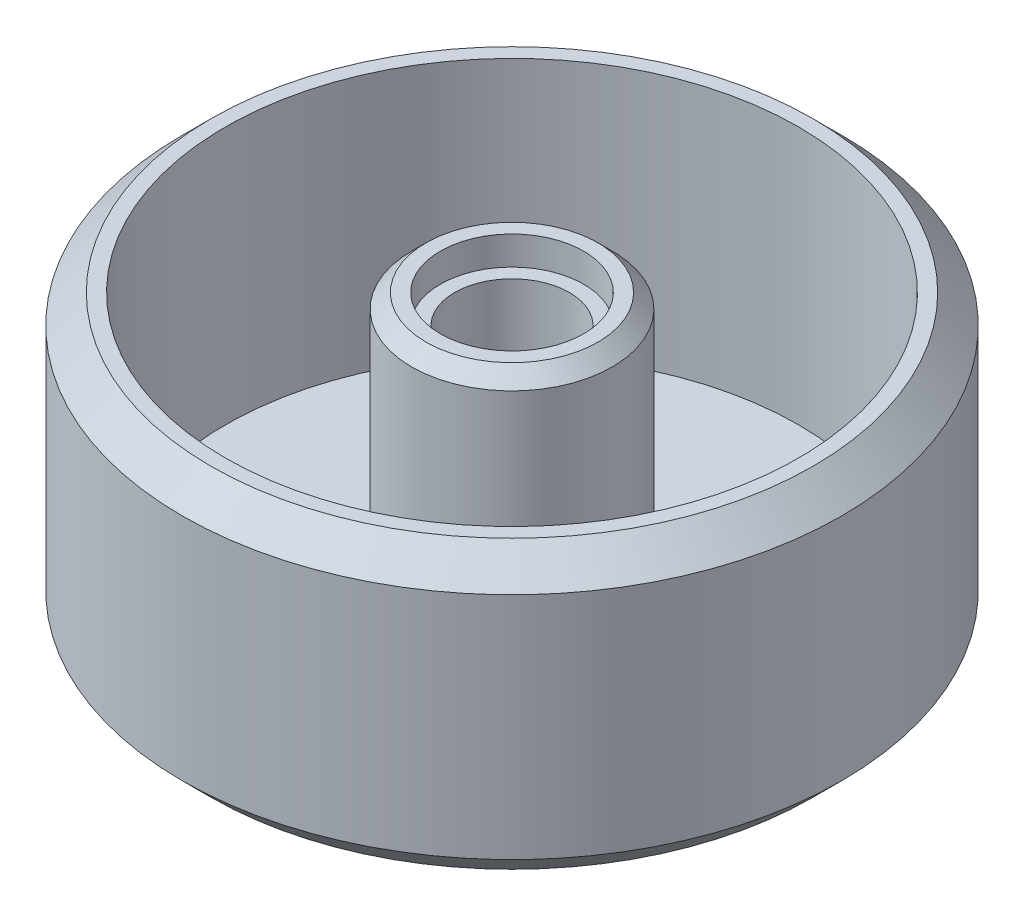
ISO-10303-21;
HEADER;
FILE_DESCRIPTION(('STEP AP214'),'2;1');
FILE_NAME('part.step','',(''),(''),'','','');
FILE_SCHEMA(('AUTOMOTIVE_DESIGN { 1 0 10303 214 1 1 1 1 }'));
ENDSEC;
DATA;
#1=APPLICATION_CONTEXT('core data for automotive mechanical design processes');
#2=APPLICATION_PROTOCOL_DEFINITION('international standard','automotive_design',2000,#1);
#3=PRODUCT_CONTEXT('',#1,'mechanical');
#4=PRODUCT('Part','Part','',(#3));
#5=PRODUCT_RELATED_PRODUCT_CATEGORY('part','',(#4));
#6=PRODUCT_DEFINITION_FORMATION('','',#4);
#7=PRODUCT_DEFINITION_CONTEXT('part definition',#1,'design');
#8=PRODUCT_DEFINITION('design','',#6,#7);
#9=PRODUCT_DEFINITION_SHAPE('','',#8);
#10=(LENGTH_UNIT() NAMED_UNIT(*) SI_UNIT(.MILLI.,.METRE.));
#11=(NAMED_UNIT(*) PLANE_ANGLE_UNIT() SI_UNIT($,.RADIAN.));
#12=(NAMED_UNIT(*) SI_UNIT($,.STERADIAN.) SOLID_ANGLE_UNIT());
#13=UNCERTAINTY_MEASURE_WITH_UNIT(LENGTH_MEASURE(1.E-05),#10,'distance_accuracy_value','');
#14=(GEOMETRIC_REPRESENTATION_CONTEXT(3) GLOBAL_UNCERTAINTY_ASSIGNED_CONTEXT((#13)) GLOBAL_UNIT_ASSIGNED_CONTEXT((#10,
#11,#12)) REPRESENTATION_CONTEXT('',''));
#15=CARTESIAN_POINT('',(0.,0.,0.));
#16=DIRECTION('',(0.,0.,1.));
#17=DIRECTION('',(1.,0.,0.));
#18=AXIS2_PLACEMENT_3D('',#15,#16,#17);
#19=CARTESIAN_POINT('',(0.,10.,0.));
#20=DIRECTION('',(0.,-1.,0.));
#21=DIRECTION('',(0.,0.,-1.));
#22=AXIS2_PLACEMENT_3D('',#19,#20,#21);
#23=CYLINDRICAL_SURFACE('',#22,11.5);
#24=CARTESIAN_POINT('',(0.,1.,0.));
#25=DIRECTION('',(0.,1.,0.));
#26=DIRECTION('',(0.,0.,1.));
#27=AXIS2_PLACEMENT_3D('',#24,#25,#26);
#28=CIRCLE('',#27,11.5);
#29=CARTESIAN_POINT('',(0.,1.,11.5));
#30=VERTEX_POINT('',#29);
#31=EDGE_CURVE('E52',#30,#30,#28,.T.);
#32=ORIENTED_EDGE('',*,*,#31,.T.);
#33=EDGE_LOOP('',(#32));
#34=FACE_BOUND('',#33,.T.);
#35=CARTESIAN_POINT('',(0.,9.,0.));
#36=DIRECTION('',(0.,1.,0.));
#37=DIRECTION('',(0.,0.,1.));
#38=AXIS2_PLACEMENT_3D('',#35,#36,#37);
#39=CIRCLE('',#38,11.5);
#40=CARTESIAN_POINT('',(0.,9.,11.5));
#41=VERTEX_POINT('',#40);
#42=EDGE_CURVE('E55',#41,#41,#39,.F.);
#43=ORIENTED_EDGE('',*,*,#42,.T.);
#44=EDGE_LOOP('',(#43));
#45=FACE_BOUND('',#44,.T.);
#46=ADVANCED_FACE('F32',(#34,#45),#23,.T.);
#47=CARTESIAN_POINT('',(0.,10.,0.));
#48=DIRECTION('',(0.,1.,0.));
#49=DIRECTION('',(0.,0.,1.));
#50=AXIS2_PLACEMENT_3D('',#47,#48,#49);
#51=PLANE('',#50);
#52=CARTESIAN_POINT('',(0.,10.,0.));
#53=DIRECTION('',(0.,1.,0.));
#54=DIRECTION('',(0.,0.,1.));
#55=AXIS2_PLACEMENT_3D('',#52,#53,#54);
#56=CIRCLE('',#55,10.5);
#57=CARTESIAN_POINT('',(0.,10.,10.5));
#58=VERTEX_POINT('',#57);
#59=EDGE_CURVE('E43',#58,#58,#56,.T.);
#60=ORIENTED_EDGE('',*,*,#59,.T.);
#61=EDGE_LOOP('',(#60));
#62=FACE_BOUND('',#61,.T.);
#63=CARTESIAN_POINT('',(0.,10.,0.));
#64=DIRECTION('',(0.,1.,0.));
#65=DIRECTION('',(0.,0.,1.));
#66=AXIS2_PLACEMENT_3D('',#63,#64,#65);
#67=CIRCLE('',#66,10.);
#68=CARTESIAN_POINT('',(0.,10.,10.));
#69=VERTEX_POINT('',#68);
#70=EDGE_CURVE('E59',#69,#69,#67,.T.);
#71=ORIENTED_EDGE('',*,*,#70,.F.);
#72=EDGE_LOOP('',(#71));
#73=FACE_BOUND('',#72,.T.);
#74=ADVANCED_FACE('F104',(#62,#73),#51,.T.);
#75=CARTESIAN_POINT('',(0.,0.,0.));
#76=DIRECTION('',(0.,1.,0.));
#77=DIRECTION('',(0.,0.,1.));
#78=AXIS2_PLACEMENT_3D('',#75,#76,#77);
#79=PLANE('',#78);
#80=CARTESIAN_POINT('',(0.,0.,0.));
#81=DIRECTION('',(0.,1.,0.));
#82=DIRECTION('',(0.,0.,1.));
#83=AXIS2_PLACEMENT_3D('',#80,#81,#82);
#84=CIRCLE('',#83,10.5);
#85=CARTESIAN_POINT('',(0.,0.,10.5));
#86=VERTEX_POINT('',#85);
#87=EDGE_CURVE('E47',#86,#86,#84,.F.);
#88=ORIENTED_EDGE('',*,*,#87,.T.);
#89=EDGE_LOOP('',(#88));
#90=FACE_BOUND('',#89,.T.);
#91=CARTESIAN_POINT('',(0.,0.,0.));
#92=DIRECTION('',(0.,-1.,0.));
#93=DIRECTION('',(0.,0.,-1.));
#94=AXIS2_PLACEMENT_3D('',#91,#92,#93);
#95=CIRCLE('',#94,2.5);
#96=CARTESIAN_POINT('',(0.,0.,-2.5));
#97=VERTEX_POINT('',#96);
#98=EDGE_CURVE('E74',#97,#97,#95,.T.);
#99=ORIENTED_EDGE('',*,*,#98,.F.);
#100=EDGE_LOOP('',(#99));
#101=FACE_BOUND('',#100,.T.);
#102=ADVANCED_FACE('F101',(#90,#101),#79,.F.);
#103=CARTESIAN_POINT('',(0.,1.,0.));
#104=DIRECTION('',(0.,1.,0.));
#105=DIRECTION('',(0.,0.,1.));
#106=AXIS2_PLACEMENT_3D('',#103,#104,#105);
#107=CYLINDRICAL_SURFACE('',#106,10.);
#108=CARTESIAN_POINT('',(0.,1.,0.));
#109=DIRECTION('',(0.,1.,0.));
#110=DIRECTION('',(0.,0.,1.));
#111=AXIS2_PLACEMENT_3D('',#108,#109,#110);
#112=CIRCLE('',#111,10.);
#113=CARTESIAN_POINT('',(0.,1.,10.));
#114=VERTEX_POINT('',#113);
#115=EDGE_CURVE('E58',#114,#114,#112,.T.);
#116=ORIENTED_EDGE('',*,*,#115,.F.);
#117=EDGE_LOOP('',(#116));
#118=FACE_BOUND('',#117,.T.);
#119=ORIENTED_EDGE('',*,*,#70,.T.);
#120=EDGE_LOOP('',(#119));
#121=FACE_BOUND('',#120,.T.);
#122=ADVANCED_FACE('F103',(#118,#121),#107,.F.);
#123=CARTESIAN_POINT('',(0.,1.,0.));
#124=DIRECTION('',(0.,1.,0.));
#125=DIRECTION('',(0.,0.,1.));
#126=AXIS2_PLACEMENT_3D('',#123,#124,#125);
#127=PLANE('',#126);
#128=CARTESIAN_POINT('',(0.,1.,0.));
#129=DIRECTION('',(0.,1.,0.));
#130=DIRECTION('',(0.,0.,1.));
#131=AXIS2_PLACEMENT_3D('',#128,#129,#130);
#132=CIRCLE('',#131,3.5);
#133=CARTESIAN_POINT('',(0.,1.,3.5));
#134=VERTEX_POINT('',#133);
#135=EDGE_CURVE('E62',#134,#134,#132,.T.);
#136=ORIENTED_EDGE('',*,*,#135,.F.);
#137=EDGE_LOOP('',(#136));
#138=FACE_BOUND('',#137,.T.);
#139=ORIENTED_EDGE('',*,*,#115,.T.);
#140=EDGE_LOOP('',(#139));
#141=FACE_BOUND('',#140,.T.);
#142=ADVANCED_FACE('F111',(#138,#141),#127,.T.);
#143=CARTESIAN_POINT('',(0.,1.,0.));
#144=DIRECTION('',(0.,1.,0.));
#145=DIRECTION('',(0.,0.,1.));
#146=AXIS2_PLACEMENT_3D('',#143,#144,#145);
#147=CYLINDRICAL_SURFACE('',#146,3.5);
#148=CARTESIAN_POINT('',(0.,9.5,0.));
#149=DIRECTION('',(0.,1.,0.));
#150=DIRECTION('',(0.,0.,1.));
#151=AXIS2_PLACEMENT_3D('',#148,#149,#150);
#152=CIRCLE('',#151,3.5);
#153=CARTESIAN_POINT('',(0.,9.5,3.5));
#154=VERTEX_POINT('',#153);
#155=EDGE_CURVE('E10',#154,#154,#152,.F.);
#156=ORIENTED_EDGE('',*,*,#155,.T.);
#157=EDGE_LOOP('',(#156));
#158=FACE_BOUND('',#157,.T.);
#159=ORIENTED_EDGE('',*,*,#135,.T.);
#160=EDGE_LOOP('',(#159));
#161=FACE_BOUND('',#160,.T.);
#162=ADVANCED_FACE('F154',(#158,#161),#147,.T.);
#163=CARTESIAN_POINT('',(0.,10.,0.));
#164=DIRECTION('',(0.,1.,0.));
#165=DIRECTION('',(0.,0.,1.));
#166=AXIS2_PLACEMENT_3D('',#163,#164,#165);
#167=CIRCLE('',#166,3.);
#168=CARTESIAN_POINT('',(0.,10.,3.));
#169=VERTEX_POINT('',#168);
#170=EDGE_CURVE('E39',#169,#169,#167,.T.);
#171=ORIENTED_EDGE('',*,*,#170,.T.);
#172=EDGE_LOOP('',(#171));
#173=FACE_BOUND('',#172,.T.);
#174=CARTESIAN_POINT('',(0.,10.,0.));
#175=DIRECTION('',(0.,1.,0.));
#176=DIRECTION('',(0.,0.,1.));
#177=AXIS2_PLACEMENT_3D('',#174,#175,#176);
#178=CIRCLE('',#177,2.5);
#179=CARTESIAN_POINT('',(0.,10.,2.5));
#180=VERTEX_POINT('',#179);
#181=EDGE_CURVE('E68',#180,#180,#178,.T.);
#182=ORIENTED_EDGE('',*,*,#181,.F.);
#183=EDGE_LOOP('',(#182));
#184=FACE_BOUND('',#183,.T.);
#185=ADVANCED_FACE('F116',(#173,#184),#51,.T.);
#186=CARTESIAN_POINT('',(0.,9.,0.));
#187=DIRECTION('',(0.,1.,0.));
#188=DIRECTION('',(0.,0.,1.));
#189=AXIS2_PLACEMENT_3D('',#186,#187,#188);
#190=CYLINDRICAL_SURFACE('',#189,2.5);
#191=CARTESIAN_POINT('',(0.,9.,0.));
#192=DIRECTION('',(0.,1.,0.));
#193=DIRECTION('',(0.,0.,1.));
#194=AXIS2_PLACEMENT_3D('',#191,#192,#193);
#195=CIRCLE('',#194,2.5);
#196=CARTESIAN_POINT('',(0.,9.,2.5));
#197=VERTEX_POINT('',#196);
#198=EDGE_CURVE('E67',#197,#197,#195,.T.);
#199=ORIENTED_EDGE('',*,*,#198,.F.);
#200=EDGE_LOOP('',(#199));
#201=FACE_BOUND('',#200,.T.);
#202=ORIENTED_EDGE('',*,*,#181,.T.);
#203=EDGE_LOOP('',(#202));
#204=FACE_BOUND('',#203,.T.);
#205=ADVANCED_FACE('F153',(#201,#204),#190,.F.);
#206=CARTESIAN_POINT('',(0.,9.,0.));
#207=DIRECTION('',(0.,1.,0.));
#208=DIRECTION('',(0.,0.,1.));
#209=AXIS2_PLACEMENT_3D('',#206,#207,#208);
#210=PLANE('',#209);
#211=CARTESIAN_POINT('',(0.,9.,0.));
#212=DIRECTION('',(0.,1.,0.));
#213=DIRECTION('',(0.,0.,1.));
#214=AXIS2_PLACEMENT_3D('',#211,#212,#213);
#215=CIRCLE('',#214,2.);
#216=CARTESIAN_POINT('',(0.,9.,2.));
#217=VERTEX_POINT('',#216);
#218=EDGE_CURVE('E77',#217,#217,#215,.T.);
#219=ORIENTED_EDGE('',*,*,#218,.F.);
#220=EDGE_LOOP('',(#219));
#221=FACE_BOUND('',#220,.T.);
#222=ORIENTED_EDGE('',*,*,#198,.T.);
#223=EDGE_LOOP('',(#222));
#224=FACE_BOUND('',#223,.T.);
#225=ADVANCED_FACE('F97',(#221,#224),#210,.T.);
#226=CARTESIAN_POINT('',(0.,1.,0.));
#227=DIRECTION('',(0.,-1.,0.));
#228=DIRECTION('',(0.,0.,-1.));
#229=AXIS2_PLACEMENT_3D('',#226,#227,#228);
#230=CYLINDRICAL_SURFACE('',#229,2.5);
#231=CARTESIAN_POINT('',(0.,1.,0.));
#232=DIRECTION('',(0.,-1.,0.));
#233=DIRECTION('',(0.,0.,-1.));
#234=AXIS2_PLACEMENT_3D('',#231,#232,#233);
#235=CIRCLE('',#234,2.5);
#236=CARTESIAN_POINT('',(0.,1.,-2.5));
#237=VERTEX_POINT('',#236);
#238=EDGE_CURVE('E71',#237,#237,#235,.T.);
#239=ORIENTED_EDGE('',*,*,#238,.F.);
#240=EDGE_LOOP('',(#239));
#241=FACE_BOUND('',#240,.T.);
#242=ORIENTED_EDGE('',*,*,#98,.T.);
#243=EDGE_LOOP('',(#242));
#244=FACE_BOUND('',#243,.T.);
#245=ADVANCED_FACE('F91',(#241,#244),#230,.F.);
#246=CARTESIAN_POINT('',(0.,1.,0.));
#247=DIRECTION('',(0.,-1.,0.));
#248=DIRECTION('',(0.,0.,-1.));
#249=AXIS2_PLACEMENT_3D('',#246,#247,#248);
#250=PLANE('',#249);
#251=CARTESIAN_POINT('',(0.,1.,0.));
#252=DIRECTION('',(0.,-1.,0.));
#253=DIRECTION('',(0.,0.,-1.));
#254=AXIS2_PLACEMENT_3D('',#251,#252,#253);
#255=CIRCLE('',#254,2.);
#256=CARTESIAN_POINT('',(0.,1.,-2.));
#257=VERTEX_POINT('',#256);
#258=EDGE_CURVE('E82',#257,#257,#255,.T.);
#259=ORIENTED_EDGE('',*,*,#258,.F.);
#260=EDGE_LOOP('',(#259));
#261=FACE_BOUND('',#260,.T.);
#262=ORIENTED_EDGE('',*,*,#238,.T.);
#263=EDGE_LOOP('',(#262));
#264=FACE_BOUND('',#263,.T.);
#265=ADVANCED_FACE('F88',(#261,#264),#250,.T.);
#266=CARTESIAN_POINT('',(0.,10.,0.));
#267=DIRECTION('',(0.,-1.,0.));
#268=DIRECTION('',(0.,0.,-1.));
#269=AXIS2_PLACEMENT_3D('',#266,#267,#268);
#270=CYLINDRICAL_SURFACE('',#269,2.);
#271=ORIENTED_EDGE('',*,*,#218,.T.);
#272=EDGE_LOOP('',(#271));
#273=FACE_BOUND('',#272,.T.);
#274=ORIENTED_EDGE('',*,*,#258,.T.);
#275=EDGE_LOOP('',(#274));
#276=FACE_BOUND('',#275,.T.);
#277=ADVANCED_FACE('F86',(#273,#276),#270,.F.);
#278=CARTESIAN_POINT('',(0.,1.,0.));
#279=DIRECTION('',(0.,1.,0.));
#280=DIRECTION('',(0.,0.,1.));
#281=AXIS2_PLACEMENT_3D('',#278,#279,#280);
#282=CONICAL_SURFACE('',#281,11.5,0.78539816339745);
#283=ORIENTED_EDGE('',*,*,#87,.F.);
#284=EDGE_LOOP('',(#283));
#285=FACE_BOUND('',#284,.T.);
#286=ORIENTED_EDGE('',*,*,#31,.F.);
#287=EDGE_LOOP('',(#286));
#288=FACE_BOUND('',#287,.T.);
#289=ADVANCED_FACE('F124',(#285,#288),#282,.T.);
#290=CARTESIAN_POINT('',(0.,10.,0.));
#291=DIRECTION('',(0.,-1.,0.));
#292=DIRECTION('',(0.,0.,-1.));
#293=AXIS2_PLACEMENT_3D('',#290,#291,#292);
#294=CONICAL_SURFACE('',#293,10.5,0.785398163397447);
#295=ORIENTED_EDGE('',*,*,#42,.F.);
#296=EDGE_LOOP('',(#295));
#297=FACE_BOUND('',#296,.T.);
#298=ORIENTED_EDGE('',*,*,#59,.F.);
#299=EDGE_LOOP('',(#298));
#300=FACE_BOUND('',#299,.T.);
#301=ADVANCED_FACE('F126',(#297,#300),#294,.T.);
#302=CARTESIAN_POINT('',(0.,10.,0.));
#303=DIRECTION('',(0.,-1.,0.));
#304=DIRECTION('',(0.,0.,-1.));
#305=AXIS2_PLACEMENT_3D('',#302,#303,#304);
#306=CONICAL_SURFACE('',#305,3.,0.785398163397447);
#307=ORIENTED_EDGE('',*,*,#155,.F.);
#308=EDGE_LOOP('',(#307));
#309=FACE_BOUND('',#308,.T.);
#310=ORIENTED_EDGE('',*,*,#170,.F.);
#311=EDGE_LOOP('',(#310));
#312=FACE_BOUND('',#311,.T.);
#313=ADVANCED_FACE('F34',(#309,#312),#306,.T.);
#314=CLOSED_SHELL('',(#46,#74,#102,#122,#142,#162,#185,#205,#225,#245,#265,#277,#289,#301,#313));
#315=MANIFOLD_SOLID_BREP('B2',#314);
#316=ADVANCED_BREP_SHAPE_REPRESENTATION('',(#18,#315),#14);
#317=SHAPE_DEFINITION_REPRESENTATION(#9,#316);
ENDSEC;
END-ISO-10303-21;
